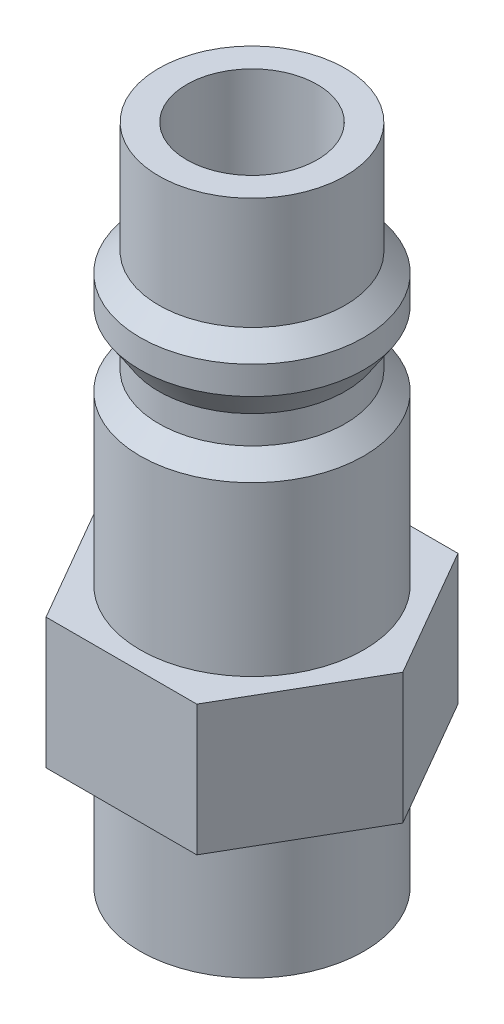
ISO-10303-21;
HEADER;
FILE_DESCRIPTION(('STEP AP214'),'2;1');
FILE_NAME('part.step','',(''),(''),'','','');
FILE_SCHEMA(('AUTOMOTIVE_DESIGN { 1 0 10303 214 1 1 1 1 }'));
ENDSEC;
DATA;
#1=APPLICATION_CONTEXT('core data for automotive mechanical design processes');
#2=APPLICATION_PROTOCOL_DEFINITION('international standard','automotive_design',2000,#1);
#3=PRODUCT_CONTEXT('',#1,'mechanical');
#4=PRODUCT('Part','Part','',(#3));
#5=PRODUCT_RELATED_PRODUCT_CATEGORY('part','',(#4));
#6=PRODUCT_DEFINITION_FORMATION('','',#4);
#7=PRODUCT_DEFINITION_CONTEXT('part definition',#1,'design');
#8=PRODUCT_DEFINITION('design','',#6,#7);
#9=PRODUCT_DEFINITION_SHAPE('','',#8);
#10=(LENGTH_UNIT() NAMED_UNIT(*) SI_UNIT(.MILLI.,.METRE.));
#11=(NAMED_UNIT(*) PLANE_ANGLE_UNIT() SI_UNIT($,.RADIAN.));
#12=(NAMED_UNIT(*) SI_UNIT($,.STERADIAN.) SOLID_ANGLE_UNIT());
#13=UNCERTAINTY_MEASURE_WITH_UNIT(LENGTH_MEASURE(1.E-05),#10,'distance_accuracy_value','');
#14=(GEOMETRIC_REPRESENTATION_CONTEXT(3) GLOBAL_UNCERTAINTY_ASSIGNED_CONTEXT((#13)) GLOBAL_UNIT_ASSIGNED_CONTEXT((#10,
#11,#12)) REPRESENTATION_CONTEXT('',''));
#15=CARTESIAN_POINT('',(0.,0.,0.));
#16=DIRECTION('',(0.,0.,1.));
#17=DIRECTION('',(1.,0.,0.));
#18=AXIS2_PLACEMENT_3D('',#15,#16,#17);
#19=CARTESIAN_POINT('',(4.04145188432746,7.,6.99999999999996));
#20=DIRECTION('',(-0.866025403784442,0.,-0.499999999999995));
#21=DIRECTION('',(-0.499999999999995,0.,0.866025403784442));
#22=AXIS2_PLACEMENT_3D('',#19,#20,#21);
#23=PLANE('',#22);
#24=DIRECTION('',(0.499999999999995,0.,-0.866025403784442));
#25=VECTOR('',#24,1.);
#26=CARTESIAN_POINT('',(4.04145188432746,0.,6.99999999999996));
#27=LINE('',#26,#25);
#28=CARTESIAN_POINT('',(4.04145188432746,0.,6.99999999999996));
#29=VERTEX_POINT('',#28);
#30=CARTESIAN_POINT('',(8.08290376865476,0.,0.));
#31=VERTEX_POINT('',#30);
#32=EDGE_CURVE('E118',#29,#31,#27,.T.);
#33=ORIENTED_EDGE('',*,*,#32,.T.);
#34=DIRECTION('',(0.,-1.,0.));
#35=VECTOR('',#34,1.);
#36=CARTESIAN_POINT('',(8.08290376865476,7.,0.));
#37=LINE('',#36,#35);
#38=CARTESIAN_POINT('',(8.08290376865476,7.,0.));
#39=VERTEX_POINT('',#38);
#40=EDGE_CURVE('E41',#39,#31,#37,.T.);
#41=ORIENTED_EDGE('',*,*,#40,.F.);
#42=DIRECTION('',(0.499999999999995,0.,-0.866025403784442));
#43=VECTOR('',#42,1.);
#44=CARTESIAN_POINT('',(4.04145188432746,7.,6.99999999999996));
#45=LINE('',#44,#43);
#46=CARTESIAN_POINT('',(4.04145188432746,7.,6.99999999999996));
#47=VERTEX_POINT('',#46);
#48=EDGE_CURVE('E129',#47,#39,#45,.T.);
#49=ORIENTED_EDGE('',*,*,#48,.F.);
#50=DIRECTION('',(0.,-1.,0.));
#51=VECTOR('',#50,1.);
#52=CARTESIAN_POINT('',(4.04145188432746,7.,6.99999999999996));
#53=LINE('',#52,#51);
#54=EDGE_CURVE('E114',#47,#29,#53,.T.);
#55=ORIENTED_EDGE('',*,*,#54,.T.);
#56=EDGE_LOOP('',(#33,#41,#49,#55));
#57=FACE_BOUND('',#56,.T.);
#58=ADVANCED_FACE('F33',(#57),#23,.F.);
#59=CARTESIAN_POINT('',(8.08290376865476,7.,0.));
#60=DIRECTION('',(-0.866025403784438,0.,0.500000000000001));
#61=DIRECTION('',(0.500000000000001,0.,0.866025403784438));
#62=AXIS2_PLACEMENT_3D('',#59,#60,#61);
#63=PLANE('',#62);
#64=DIRECTION('',(-0.500000000000001,0.,-0.866025403784438));
#65=VECTOR('',#64,1.);
#66=CARTESIAN_POINT('',(8.08290376865476,0.,0.));
#67=LINE('',#66,#65);
#68=CARTESIAN_POINT('',(4.04145188432737,0.,-7.00000000000001));
#69=VERTEX_POINT('',#68);
#70=EDGE_CURVE('E121',#31,#69,#67,.T.);
#71=ORIENTED_EDGE('',*,*,#70,.T.);
#72=DIRECTION('',(0.,-1.,0.));
#73=VECTOR('',#72,1.);
#74=CARTESIAN_POINT('',(4.04145188432737,7.,-7.00000000000001));
#75=LINE('',#74,#73);
#76=CARTESIAN_POINT('',(4.04145188432737,7.,-7.00000000000001));
#77=VERTEX_POINT('',#76);
#78=EDGE_CURVE('E133',#77,#69,#75,.T.);
#79=ORIENTED_EDGE('',*,*,#78,.F.);
#80=DIRECTION('',(-0.500000000000001,0.,-0.866025403784438));
#81=VECTOR('',#80,1.);
#82=CARTESIAN_POINT('',(8.08290376865476,7.,0.));
#83=LINE('',#82,#81);
#84=EDGE_CURVE('E87',#39,#77,#83,.T.);
#85=ORIENTED_EDGE('',*,*,#84,.F.);
#86=ORIENTED_EDGE('',*,*,#40,.T.);
#87=EDGE_LOOP('',(#71,#79,#85,#86));
#88=FACE_BOUND('',#87,.T.);
#89=ADVANCED_FACE('F136',(#88),#63,.F.);
#90=CARTESIAN_POINT('',(4.04145188432737,7.,-7.00000000000001));
#91=DIRECTION('',(0.,0.,1.));
#92=DIRECTION('',(1.,0.,0.));
#93=AXIS2_PLACEMENT_3D('',#90,#91,#92);
#94=PLANE('',#93);
#95=DIRECTION('',(-1.,0.,0.));
#96=VECTOR('',#95,1.);
#97=CARTESIAN_POINT('',(4.04145188432737,0.,-7.00000000000001));
#98=LINE('',#97,#96);
#99=CARTESIAN_POINT('',(-4.04145188432742,0.,-6.99999999999999));
#100=VERTEX_POINT('',#99);
#101=EDGE_CURVE('E124',#69,#100,#98,.T.);
#102=ORIENTED_EDGE('',*,*,#101,.T.);
#103=DIRECTION('',(0.,-1.,0.));
#104=VECTOR('',#103,1.);
#105=CARTESIAN_POINT('',(-4.04145188432742,7.,-6.99999999999999));
#106=LINE('',#105,#104);
#107=CARTESIAN_POINT('',(-4.04145188432742,7.,-6.99999999999999));
#108=VERTEX_POINT('',#107);
#109=EDGE_CURVE('E109',#108,#100,#106,.T.);
#110=ORIENTED_EDGE('',*,*,#109,.F.);
#111=DIRECTION('',(-1.,0.,0.));
#112=VECTOR('',#111,1.);
#113=CARTESIAN_POINT('',(4.04145188432737,7.,-7.00000000000001));
#114=LINE('',#113,#112);
#115=EDGE_CURVE('E100',#77,#108,#114,.T.);
#116=ORIENTED_EDGE('',*,*,#115,.F.);
#117=ORIENTED_EDGE('',*,*,#78,.T.);
#118=EDGE_LOOP('',(#102,#110,#116,#117));
#119=FACE_BOUND('',#118,.T.);
#120=ADVANCED_FACE('F144',(#119),#94,.F.);
#121=CARTESIAN_POINT('',(-4.04145188432742,7.,-6.99999999999999));
#122=DIRECTION('',(0.866025403784441,0.,0.499999999999995));
#123=DIRECTION('',(0.499999999999995,0.,-0.866025403784442));
#124=AXIS2_PLACEMENT_3D('',#121,#122,#123);
#125=PLANE('',#124);
#126=DIRECTION('',(-0.499999999999995,0.,0.866025403784441));
#127=VECTOR('',#126,1.);
#128=CARTESIAN_POINT('',(-4.04145188432742,0.,-6.99999999999999));
#129=LINE('',#128,#127);
#130=CARTESIAN_POINT('',(-8.08290376865476,0.,0.));
#131=VERTEX_POINT('',#130);
#132=EDGE_CURVE('E108',#100,#131,#129,.T.);
#133=ORIENTED_EDGE('',*,*,#132,.T.);
#134=DIRECTION('',(0.,-1.,0.));
#135=VECTOR('',#134,1.);
#136=CARTESIAN_POINT('',(-8.08290376865476,7.,0.));
#137=LINE('',#136,#135);
#138=CARTESIAN_POINT('',(-8.08290376865476,7.,0.));
#139=VERTEX_POINT('',#138);
#140=EDGE_CURVE('E105',#139,#131,#137,.T.);
#141=ORIENTED_EDGE('',*,*,#140,.F.);
#142=DIRECTION('',(-0.499999999999995,0.,0.866025403784441));
#143=VECTOR('',#142,1.);
#144=CARTESIAN_POINT('',(-4.04145188432742,7.,-6.99999999999999));
#145=LINE('',#144,#143);
#146=EDGE_CURVE('E94',#108,#139,#145,.T.);
#147=ORIENTED_EDGE('',*,*,#146,.F.);
#148=ORIENTED_EDGE('',*,*,#109,.T.);
#149=EDGE_LOOP('',(#133,#141,#147,#148));
#150=FACE_BOUND('',#149,.T.);
#151=ADVANCED_FACE('F106',(#150),#125,.F.);
#152=CARTESIAN_POINT('',(-8.08290376865476,7.,0.));
#153=DIRECTION('',(0.866025403784435,0.,-0.500000000000007));
#154=DIRECTION('',(-0.500000000000007,0.,-0.866025403784435));
#155=AXIS2_PLACEMENT_3D('',#152,#153,#154);
#156=PLANE('',#155);
#157=DIRECTION('',(0.500000000000007,0.,0.866025403784435));
#158=VECTOR('',#157,1.);
#159=CARTESIAN_POINT('',(-8.08290376865476,0.,0.));
#160=LINE('',#159,#158);
#161=CARTESIAN_POINT('',(-4.04145188432732,0.,7.00000000000004));
#162=VERTEX_POINT('',#161);
#163=EDGE_CURVE('E72',#131,#162,#160,.T.);
#164=ORIENTED_EDGE('',*,*,#163,.T.);
#165=DIRECTION('',(0.,-1.,0.));
#166=VECTOR('',#165,1.);
#167=CARTESIAN_POINT('',(-4.04145188432732,7.,7.00000000000004));
#168=LINE('',#167,#166);
#169=CARTESIAN_POINT('',(-4.04145188432732,7.,7.00000000000004));
#170=VERTEX_POINT('',#169);
#171=EDGE_CURVE('E110',#170,#162,#168,.T.);
#172=ORIENTED_EDGE('',*,*,#171,.F.);
#173=DIRECTION('',(0.500000000000007,0.,0.866025403784435));
#174=VECTOR('',#173,1.);
#175=CARTESIAN_POINT('',(-8.08290376865476,7.,0.));
#176=LINE('',#175,#174);
#177=EDGE_CURVE('E98',#139,#170,#176,.T.);
#178=ORIENTED_EDGE('',*,*,#177,.F.);
#179=ORIENTED_EDGE('',*,*,#140,.T.);
#180=EDGE_LOOP('',(#164,#172,#178,#179));
#181=FACE_BOUND('',#180,.T.);
#182=ADVANCED_FACE('F112',(#181),#156,.F.);
#183=CARTESIAN_POINT('',(-4.04145188432732,7.,7.00000000000004));
#184=DIRECTION('',(0.,0.,-1.));
#185=DIRECTION('',(-1.,0.,0.));
#186=AXIS2_PLACEMENT_3D('',#183,#184,#185);
#187=PLANE('',#186);
#188=DIRECTION('',(1.,0.,0.));
#189=VECTOR('',#188,1.);
#190=CARTESIAN_POINT('',(-4.04145188432732,0.,7.00000000000004));
#191=LINE('',#190,#189);
#192=EDGE_CURVE('E78',#162,#29,#191,.T.);
#193=ORIENTED_EDGE('',*,*,#192,.T.);
#194=ORIENTED_EDGE('',*,*,#54,.F.);
#195=DIRECTION('',(1.,0.,0.));
#196=VECTOR('',#195,1.);
#197=CARTESIAN_POINT('',(-4.04145188432732,7.,7.00000000000004));
#198=LINE('',#197,#196);
#199=EDGE_CURVE('E49',#170,#47,#198,.T.);
#200=ORIENTED_EDGE('',*,*,#199,.F.);
#201=ORIENTED_EDGE('',*,*,#171,.T.);
#202=EDGE_LOOP('',(#193,#194,#200,#201));
#203=FACE_BOUND('',#202,.T.);
#204=ADVANCED_FACE('F222',(#203),#187,.F.);
#205=CARTESIAN_POINT('',(0.,7.,0.));
#206=DIRECTION('',(0.,1.,0.));
#207=DIRECTION('',(0.,0.,1.));
#208=AXIS2_PLACEMENT_3D('',#205,#206,#207);
#209=PLANE('',#208);
#210=CARTESIAN_POINT('',(0.,7.,0.));
#211=DIRECTION('',(0.,-1.,0.));
#212=DIRECTION('',(0.,0.,-1.));
#213=AXIS2_PLACEMENT_3D('',#210,#211,#212);
#214=CIRCLE('',#213,6.);
#215=CARTESIAN_POINT('',(0.,7.,-6.));
#216=VERTEX_POINT('',#215);
#217=EDGE_CURVE('E122',#216,#216,#214,.T.);
#218=ORIENTED_EDGE('',*,*,#217,.T.);
#219=EDGE_LOOP('',(#218));
#220=FACE_BOUND('',#219,.T.);
#221=ORIENTED_EDGE('',*,*,#48,.T.);
#222=ORIENTED_EDGE('',*,*,#84,.T.);
#223=ORIENTED_EDGE('',*,*,#115,.T.);
#224=ORIENTED_EDGE('',*,*,#146,.T.);
#225=ORIENTED_EDGE('',*,*,#177,.T.);
#226=ORIENTED_EDGE('',*,*,#199,.T.);
#227=EDGE_LOOP('',(#221,#222,#223,#224,#225,#226));
#228=FACE_BOUND('',#227,.T.);
#229=ADVANCED_FACE('F96',(#220,#228),#209,.T.);
#230=CARTESIAN_POINT('',(0.,0.,0.));
#231=DIRECTION('',(0.,1.,0.));
#232=DIRECTION('',(0.,0.,1.));
#233=AXIS2_PLACEMENT_3D('',#230,#231,#232);
#234=PLANE('',#233);
#235=CARTESIAN_POINT('',(0.,0.,0.));
#236=DIRECTION('',(0.,1.,0.));
#237=DIRECTION('',(0.,0.,1.));
#238=AXIS2_PLACEMENT_3D('',#235,#236,#237);
#239=CIRCLE('',#238,6.);
#240=CARTESIAN_POINT('',(0.,0.,6.));
#241=VERTEX_POINT('',#240);
#242=EDGE_CURVE('E11',#241,#241,#239,.F.);
#243=ORIENTED_EDGE('',*,*,#242,.F.);
#244=EDGE_LOOP('',(#243));
#245=FACE_BOUND('',#244,.T.);
#246=ORIENTED_EDGE('',*,*,#32,.F.);
#247=ORIENTED_EDGE('',*,*,#192,.F.);
#248=ORIENTED_EDGE('',*,*,#163,.F.);
#249=ORIENTED_EDGE('',*,*,#132,.F.);
#250=ORIENTED_EDGE('',*,*,#101,.F.);
#251=ORIENTED_EDGE('',*,*,#70,.F.);
#252=EDGE_LOOP('',(#246,#247,#248,#249,#250,#251));
#253=FACE_BOUND('',#252,.T.);
#254=ADVANCED_FACE('F141',(#245,#253),#234,.F.);
#255=CARTESIAN_POINT('',(0.,0.,0.));
#256=DIRECTION('',(0.,-1.,0.));
#257=DIRECTION('',(0.,0.,-1.));
#258=AXIS2_PLACEMENT_3D('',#255,#256,#257);
#259=CYLINDRICAL_SURFACE('',#258,6.);
#260=ORIENTED_EDGE('',*,*,#217,.F.);
#261=EDGE_LOOP('',(#260));
#262=FACE_BOUND('',#261,.T.);
#263=CARTESIAN_POINT('',(0.,16.,0.));
#264=DIRECTION('',(0.,-1.,0.));
#265=DIRECTION('',(0.,0.,-1.));
#266=AXIS2_PLACEMENT_3D('',#263,#264,#265);
#267=CIRCLE('',#266,6.);
#268=CARTESIAN_POINT('',(0.,16.,-6.));
#269=VERTEX_POINT('',#268);
#270=EDGE_CURVE('E150',#269,#269,#267,.T.);
#271=ORIENTED_EDGE('',*,*,#270,.T.);
#272=EDGE_LOOP('',(#271));
#273=FACE_BOUND('',#272,.T.);
#274=ADVANCED_FACE('F227',(#262,#273),#259,.T.);
#275=CARTESIAN_POINT('',(0.,17.,0.));
#276=DIRECTION('',(0.,-1.,0.));
#277=DIRECTION('',(0.,0.,-1.));
#278=AXIS2_PLACEMENT_3D('',#275,#276,#277);
#279=CONICAL_SURFACE('',#278,5.,0.785398163397446);
#280=ORIENTED_EDGE('',*,*,#270,.F.);
#281=EDGE_LOOP('',(#280));
#282=FACE_BOUND('',#281,.T.);
#283=CARTESIAN_POINT('',(0.,17.,0.));
#284=DIRECTION('',(0.,-1.,0.));
#285=DIRECTION('',(0.,0.,-1.));
#286=AXIS2_PLACEMENT_3D('',#283,#284,#285);
#287=CIRCLE('',#286,5.);
#288=CARTESIAN_POINT('',(0.,17.,-5.));
#289=VERTEX_POINT('',#288);
#290=EDGE_CURVE('E153',#289,#289,#287,.T.);
#291=ORIENTED_EDGE('',*,*,#290,.T.);
#292=EDGE_LOOP('',(#291));
#293=FACE_BOUND('',#292,.T.);
#294=ADVANCED_FACE('F234',(#282,#293),#279,.T.);
#295=CARTESIAN_POINT('',(0.,0.,0.));
#296=DIRECTION('',(0.,-1.,0.));
#297=DIRECTION('',(0.,0.,-1.));
#298=AXIS2_PLACEMENT_3D('',#295,#296,#297);
#299=CYLINDRICAL_SURFACE('',#298,5.);
#300=ORIENTED_EDGE('',*,*,#290,.F.);
#301=EDGE_LOOP('',(#300));
#302=FACE_BOUND('',#301,.T.);
#303=CARTESIAN_POINT('',(0.,18.5,0.));
#304=DIRECTION('',(0.,-1.,0.));
#305=DIRECTION('',(0.,0.,-1.));
#306=AXIS2_PLACEMENT_3D('',#303,#304,#305);
#307=CIRCLE('',#306,5.);
#308=CARTESIAN_POINT('',(0.,18.5,-5.));
#309=VERTEX_POINT('',#308);
#310=EDGE_CURVE('E156',#309,#309,#307,.T.);
#311=ORIENTED_EDGE('',*,*,#310,.T.);
#312=EDGE_LOOP('',(#311));
#313=FACE_BOUND('',#312,.T.);
#314=ADVANCED_FACE('F238',(#302,#313),#299,.T.);
#315=CARTESIAN_POINT('',(0.,20.,0.));
#316=DIRECTION('',(0.,1.,0.));
#317=DIRECTION('',(0.,0.,1.));
#318=AXIS2_PLACEMENT_3D('',#315,#316,#317);
#319=CONICAL_SURFACE('',#318,6.,0.588002603547567);
#320=ORIENTED_EDGE('',*,*,#310,.F.);
#321=EDGE_LOOP('',(#320));
#322=FACE_BOUND('',#321,.T.);
#323=CARTESIAN_POINT('',(0.,20.,0.));
#324=DIRECTION('',(0.,-1.,0.));
#325=DIRECTION('',(0.,0.,-1.));
#326=AXIS2_PLACEMENT_3D('',#323,#324,#325);
#327=CIRCLE('',#326,6.);
#328=CARTESIAN_POINT('',(0.,20.,-6.));
#329=VERTEX_POINT('',#328);
#330=EDGE_CURVE('E159',#329,#329,#327,.T.);
#331=ORIENTED_EDGE('',*,*,#330,.T.);
#332=EDGE_LOOP('',(#331));
#333=FACE_BOUND('',#332,.T.);
#334=ADVANCED_FACE('F242',(#322,#333),#319,.T.);
#335=CARTESIAN_POINT('',(0.,0.,0.));
#336=DIRECTION('',(0.,-1.,0.));
#337=DIRECTION('',(0.,0.,-1.));
#338=AXIS2_PLACEMENT_3D('',#335,#336,#337);
#339=CYLINDRICAL_SURFACE('',#338,6.);
#340=ORIENTED_EDGE('',*,*,#330,.F.);
#341=EDGE_LOOP('',(#340));
#342=FACE_BOUND('',#341,.T.);
#343=CARTESIAN_POINT('',(0.,21.5,0.));
#344=DIRECTION('',(0.,-1.,0.));
#345=DIRECTION('',(0.,0.,-1.));
#346=AXIS2_PLACEMENT_3D('',#343,#344,#345);
#347=CIRCLE('',#346,6.);
#348=CARTESIAN_POINT('',(0.,21.5,-6.));
#349=VERTEX_POINT('',#348);
#350=EDGE_CURVE('E162',#349,#349,#347,.T.);
#351=ORIENTED_EDGE('',*,*,#350,.T.);
#352=EDGE_LOOP('',(#351));
#353=FACE_BOUND('',#352,.T.);
#354=ADVANCED_FACE('F205',(#342,#353),#339,.T.);
#355=CARTESIAN_POINT('',(0.,22.5,0.));
#356=DIRECTION('',(0.,-1.,0.));
#357=DIRECTION('',(0.,0.,-1.));
#358=AXIS2_PLACEMENT_3D('',#355,#356,#357);
#359=CONICAL_SURFACE('',#358,5.,0.785398163397448);
#360=ORIENTED_EDGE('',*,*,#350,.F.);
#361=EDGE_LOOP('',(#360));
#362=FACE_BOUND('',#361,.T.);
#363=CARTESIAN_POINT('',(0.,22.5,0.));
#364=DIRECTION('',(0.,-1.,0.));
#365=DIRECTION('',(0.,0.,-1.));
#366=AXIS2_PLACEMENT_3D('',#363,#364,#365);
#367=CIRCLE('',#366,5.);
#368=CARTESIAN_POINT('',(0.,22.5,-5.));
#369=VERTEX_POINT('',#368);
#370=EDGE_CURVE('E165',#369,#369,#367,.T.);
#371=ORIENTED_EDGE('',*,*,#370,.T.);
#372=EDGE_LOOP('',(#371));
#373=FACE_BOUND('',#372,.T.);
#374=ADVANCED_FACE('F199',(#362,#373),#359,.T.);
#375=CARTESIAN_POINT('',(0.,0.,0.));
#376=DIRECTION('',(0.,-1.,0.));
#377=DIRECTION('',(0.,0.,-1.));
#378=AXIS2_PLACEMENT_3D('',#375,#376,#377);
#379=CYLINDRICAL_SURFACE('',#378,5.);
#380=ORIENTED_EDGE('',*,*,#370,.F.);
#381=EDGE_LOOP('',(#380));
#382=FACE_BOUND('',#381,.T.);
#383=CARTESIAN_POINT('',(0.,28.5,0.));
#384=DIRECTION('',(0.,-1.,0.));
#385=DIRECTION('',(0.,0.,-1.));
#386=AXIS2_PLACEMENT_3D('',#383,#384,#385);
#387=CIRCLE('',#386,5.);
#388=CARTESIAN_POINT('',(0.,28.5,-5.));
#389=VERTEX_POINT('',#388);
#390=EDGE_CURVE('E168',#389,#389,#387,.T.);
#391=ORIENTED_EDGE('',*,*,#390,.T.);
#392=EDGE_LOOP('',(#391));
#393=FACE_BOUND('',#392,.T.);
#394=ADVANCED_FACE('F194',(#382,#393),#379,.T.);
#395=CARTESIAN_POINT('',(-5.,28.5,0.));
#396=DIRECTION('',(0.,-1.,0.));
#397=DIRECTION('',(0.,0.,-1.));
#398=AXIS2_PLACEMENT_3D('',#395,#396,#397);
#399=PLANE('',#398);
#400=CARTESIAN_POINT('',(0.,28.5,0.));
#401=DIRECTION('',(0.,1.,0.));
#402=DIRECTION('',(0.,0.,1.));
#403=AXIS2_PLACEMENT_3D('',#400,#401,#402);
#404=CIRCLE('',#403,3.5);
#405=CARTESIAN_POINT('',(0.,28.5,3.5));
#406=VERTEX_POINT('',#405);
#407=EDGE_CURVE('E175',#406,#406,#404,.T.);
#408=ORIENTED_EDGE('',*,*,#407,.F.);
#409=EDGE_LOOP('',(#408));
#410=FACE_BOUND('',#409,.T.);
#411=ORIENTED_EDGE('',*,*,#390,.F.);
#412=EDGE_LOOP('',(#411));
#413=FACE_BOUND('',#412,.T.);
#414=ADVANCED_FACE('F190',(#410,#413),#399,.F.);
#415=CARTESIAN_POINT('',(0.,-7.,0.));
#416=DIRECTION('',(0.,1.,0.));
#417=DIRECTION('',(0.,0.,1.));
#418=AXIS2_PLACEMENT_3D('',#415,#416,#417);
#419=CYLINDRICAL_SURFACE('',#418,6.);
#420=CARTESIAN_POINT('',(0.,-7.,0.));
#421=DIRECTION('',(0.,-1.,0.));
#422=DIRECTION('',(0.,0.,-1.));
#423=AXIS2_PLACEMENT_3D('',#420,#421,#422);
#424=CIRCLE('',#423,6.);
#425=CARTESIAN_POINT('',(0.,-7.,-6.));
#426=VERTEX_POINT('',#425);
#427=EDGE_CURVE('E171',#426,#426,#424,.T.);
#428=ORIENTED_EDGE('',*,*,#427,.F.);
#429=EDGE_LOOP('',(#428));
#430=FACE_BOUND('',#429,.T.);
#431=ORIENTED_EDGE('',*,*,#242,.T.);
#432=EDGE_LOOP('',(#431));
#433=FACE_BOUND('',#432,.T.);
#434=ADVANCED_FACE('F193',(#430,#433),#419,.T.);
#435=CARTESIAN_POINT('',(0.,-7.,0.));
#436=DIRECTION('',(0.,-1.,0.));
#437=DIRECTION('',(0.,0.,-1.));
#438=AXIS2_PLACEMENT_3D('',#435,#436,#437);
#439=PLANE('',#438);
#440=CARTESIAN_POINT('',(0.,-7.,0.));
#441=DIRECTION('',(0.,1.,0.));
#442=DIRECTION('',(0.,0.,1.));
#443=AXIS2_PLACEMENT_3D('',#440,#441,#442);
#444=CIRCLE('',#443,3.5);
#445=CARTESIAN_POINT('',(0.,-7.,3.5));
#446=VERTEX_POINT('',#445);
#447=EDGE_CURVE('E174',#446,#446,#444,.T.);
#448=ORIENTED_EDGE('',*,*,#447,.T.);
#449=EDGE_LOOP('',(#448));
#450=FACE_BOUND('',#449,.T.);
#451=ORIENTED_EDGE('',*,*,#427,.T.);
#452=EDGE_LOOP('',(#451));
#453=FACE_BOUND('',#452,.T.);
#454=ADVANCED_FACE('F181',(#450,#453),#439,.T.);
#455=CARTESIAN_POINT('',(0.,-7.,0.));
#456=DIRECTION('',(0.,1.,0.));
#457=DIRECTION('',(0.,0.,1.));
#458=AXIS2_PLACEMENT_3D('',#455,#456,#457);
#459=CYLINDRICAL_SURFACE('',#458,3.5);
#460=ORIENTED_EDGE('',*,*,#447,.F.);
#461=EDGE_LOOP('',(#460));
#462=FACE_BOUND('',#461,.T.);
#463=ORIENTED_EDGE('',*,*,#407,.T.);
#464=EDGE_LOOP('',(#463));
#465=FACE_BOUND('',#464,.T.);
#466=ADVANCED_FACE('F184',(#462,#465),#459,.F.);
#467=CLOSED_SHELL('',(#58,#89,#120,#151,#182,#204,#229,#254,#274,#294,#314,#334,#354,#374,#394,
#414,#434,#454,#466));
#468=MANIFOLD_SOLID_BREP('B2',#467);
#469=ADVANCED_BREP_SHAPE_REPRESENTATION('',(#18,#468),#14);
#470=SHAPE_DEFINITION_REPRESENTATION(#9,#469);
ENDSEC;
END-ISO-10303-21;
